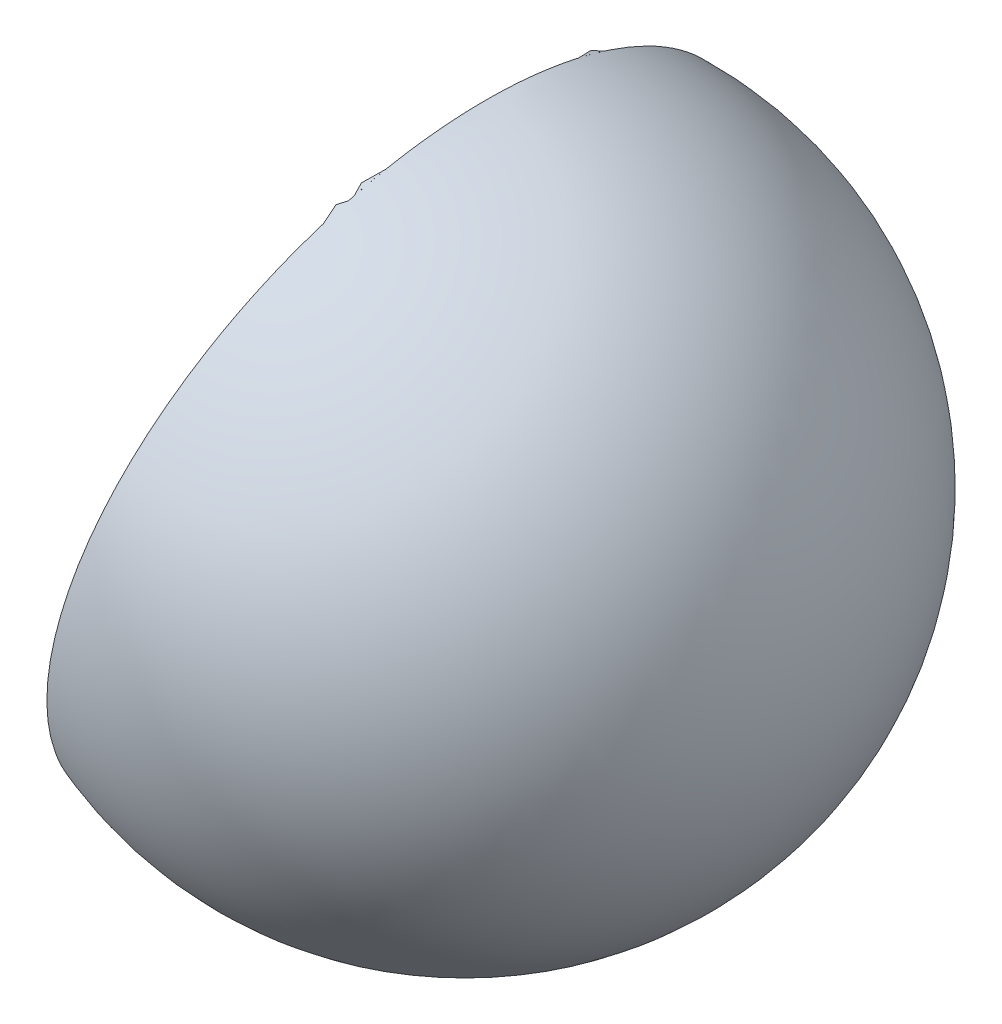
ISO-10303-21;
HEADER;
FILE_DESCRIPTION(('STEP AP214'),'2;1');
FILE_NAME('part.step','',(''),(''),'','','');
FILE_SCHEMA(('AUTOMOTIVE_DESIGN { 1 0 10303 214 1 1 1 1 }'));
ENDSEC;
DATA;
#1=APPLICATION_CONTEXT('core data for automotive mechanical design processes');
#2=APPLICATION_PROTOCOL_DEFINITION('international standard','automotive_design',2000,#1);
#3=PRODUCT_CONTEXT('',#1,'mechanical');
#4=PRODUCT('Part','Part','',(#3));
#5=PRODUCT_RELATED_PRODUCT_CATEGORY('part','',(#4));
#6=PRODUCT_DEFINITION_FORMATION('','',#4);
#7=PRODUCT_DEFINITION_CONTEXT('part definition',#1,'design');
#8=PRODUCT_DEFINITION('design','',#6,#7);
#9=PRODUCT_DEFINITION_SHAPE('','',#8);
#10=(LENGTH_UNIT() NAMED_UNIT(*) SI_UNIT(.MILLI.,.METRE.));
#11=(NAMED_UNIT(*) PLANE_ANGLE_UNIT() SI_UNIT($,.RADIAN.));
#12=(NAMED_UNIT(*) SI_UNIT($,.STERADIAN.) SOLID_ANGLE_UNIT());
#13=UNCERTAINTY_MEASURE_WITH_UNIT(LENGTH_MEASURE(1.E-05),#10,'distance_accuracy_value','');
#14=(GEOMETRIC_REPRESENTATION_CONTEXT(3) GLOBAL_UNCERTAINTY_ASSIGNED_CONTEXT((#13)) GLOBAL_UNIT_ASSIGNED_CONTEXT((#10,
#11,#12)) REPRESENTATION_CONTEXT('',''));
#15=CARTESIAN_POINT('',(0.,0.,0.));
#16=DIRECTION('',(0.,0.,1.));
#17=DIRECTION('',(1.,0.,0.));
#18=AXIS2_PLACEMENT_3D('',#15,#16,#17);
#19=CARTESIAN_POINT('',(-9.65925826289068,2.58819045102521,0.));
#20=DIRECTION('',(0.965925826289068,-0.258819045102521,0.));
#21=DIRECTION('',(0.258819045102521,0.965925826289068,0.));
#22=AXIS2_PLACEMENT_3D('',#19,#20,#21);
#23=PLANE('',#22);
#24=DIRECTION('',(-0.258819045102521,-0.965925826289068,0.));
#25=VECTOR('',#24,1.);
#26=CARTESIAN_POINT('',(-2.69443775918183,28.581254436464,1.75));
#27=LINE('',#26,#25);
#28=CARTESIAN_POINT('',(-2.69443775918183,28.581254436464,1.75000000000001));
#29=VERTEX_POINT('',#28);
#30=CARTESIAN_POINT('',(-7.30659314290877,11.3684562119928,1.75));
#31=VERTEX_POINT('',#30);
#32=EDGE_CURVE('E269',#29,#31,#27,.T.);
#33=ORIENTED_EDGE('',*,*,#32,.F.);
#34=CARTESIAN_POINT('',(-5.07050564619142,19.7136483599115,13.));
#35=DIRECTION('',(0.965925826289068,-0.258819045102521,0.));
#36=DIRECTION('',(0.258819045102521,0.965925826289068,0.));
#37=AXIS2_PLACEMENT_3D('',#34,#35,#36);
#38=CIRCLE('',#37,14.5204213483146);
#39=CARTESIAN_POINT('',(-2.69443775918184,28.581254436464,24.25));
#40=VERTEX_POINT('',#39);
#41=EDGE_CURVE('E272',#40,#29,#38,.F.);
#42=ORIENTED_EDGE('',*,*,#41,.F.);
#43=DIRECTION('',(0.258819045102521,0.965925826289068,0.));
#44=VECTOR('',#43,1.);
#45=CARTESIAN_POINT('',(-7.30659314290877,11.3684562119928,24.25));
#46=LINE('',#45,#44);
#47=CARTESIAN_POINT('',(-7.30659314290877,11.3684562119928,24.25));
#48=VERTEX_POINT('',#47);
#49=EDGE_CURVE('E274',#48,#40,#46,.T.);
#50=ORIENTED_EDGE('',*,*,#49,.F.);
#51=CARTESIAN_POINT('',(-4.93052525589918,20.2360622885454,13.));
#52=DIRECTION('',(0.965925826289068,-0.258819045102521,0.));
#53=DIRECTION('',(0.258819045102521,0.965925826289068,0.));
#54=AXIS2_PLACEMENT_3D('',#51,#52,#53);
#55=CIRCLE('',#54,14.5204213483146);
#56=EDGE_CURVE('E276',#31,#48,#55,.F.);
#57=ORIENTED_EDGE('',*,*,#56,.F.);
#58=EDGE_LOOP('',(#33,#42,#50,#57));
#59=FACE_BOUND('',#58,.T.);
#60=DIRECTION('',(-0.258819045102521,-0.965925826289068,0.));
#61=VECTOR('',#60,1.);
#62=CARTESIAN_POINT('',(-2.69443775918183,28.581254436464,-24.25));
#63=LINE('',#62,#61);
#64=CARTESIAN_POINT('',(-2.69443775918183,28.581254436464,-24.25));
#65=VERTEX_POINT('',#64);
#66=CARTESIAN_POINT('',(-7.30659314290877,11.3684562119928,-24.25));
#67=VERTEX_POINT('',#66);
#68=EDGE_CURVE('E251',#65,#67,#63,.T.);
#69=ORIENTED_EDGE('',*,*,#68,.F.);
#70=CARTESIAN_POINT('',(-5.07050564619142,19.7136483599115,-13.));
#71=DIRECTION('',(0.965925826289068,-0.258819045102521,0.));
#72=DIRECTION('',(0.258819045102521,0.965925826289068,0.));
#73=AXIS2_PLACEMENT_3D('',#70,#71,#72);
#74=CIRCLE('',#73,14.5204213483146);
#75=CARTESIAN_POINT('',(-2.69443775918184,28.581254436464,-1.74999999999999));
#76=VERTEX_POINT('',#75);
#77=EDGE_CURVE('E254',#76,#65,#74,.F.);
#78=ORIENTED_EDGE('',*,*,#77,.F.);
#79=DIRECTION('',(0.258819045102521,0.965925826289068,0.));
#80=VECTOR('',#79,1.);
#81=CARTESIAN_POINT('',(-7.30659314290877,11.3684562119928,-1.74999999999999));
#82=LINE('',#81,#80);
#83=CARTESIAN_POINT('',(-7.30659314290877,11.3684562119928,-1.74999999999999));
#84=VERTEX_POINT('',#83);
#85=EDGE_CURVE('E256',#84,#76,#82,.T.);
#86=ORIENTED_EDGE('',*,*,#85,.F.);
#87=CARTESIAN_POINT('',(-4.93052525589918,20.2360622885454,-13.));
#88=DIRECTION('',(0.965925826289068,-0.258819045102521,0.));
#89=DIRECTION('',(0.258819045102521,0.965925826289068,0.));
#90=AXIS2_PLACEMENT_3D('',#87,#88,#89);
#91=CIRCLE('',#90,14.5204213483146);
#92=EDGE_CURVE('E258',#67,#84,#91,.F.);
#93=ORIENTED_EDGE('',*,*,#92,.F.);
#94=EDGE_LOOP('',(#69,#78,#86,#93));
#95=FACE_BOUND('',#94,.T.);
#96=DIRECTION('',(-0.258819045102521,-0.965925826289068,0.));
#97=VECTOR('',#96,1.);
#98=CARTESIAN_POINT('',(-12.0119233828726,-6.19207530994241,-24.25));
#99=LINE('',#98,#97);
#100=CARTESIAN_POINT('',(-12.0119233828726,-6.19207530994241,-24.25));
#101=VERTEX_POINT('',#100);
#102=CARTESIAN_POINT('',(-16.6240787665995,-23.4048735344136,-24.25));
#103=VERTEX_POINT('',#102);
#104=EDGE_CURVE('E155',#101,#103,#99,.T.);
#105=ORIENTED_EDGE('',*,*,#104,.F.);
#106=CARTESIAN_POINT('',(-14.3879912698822,-15.059681386495,-13.));
#107=DIRECTION('',(0.965925826289068,-0.258819045102521,0.));
#108=DIRECTION('',(0.258819045102521,0.965925826289068,0.));
#109=AXIS2_PLACEMENT_3D('',#106,#107,#108);
#110=CIRCLE('',#109,14.5204213483146);
#111=CARTESIAN_POINT('',(-12.0119233828726,-6.19207530994242,-1.74999999999999));
#112=VERTEX_POINT('',#111);
#113=EDGE_CURVE('E245',#112,#101,#110,.F.);
#114=ORIENTED_EDGE('',*,*,#113,.F.);
#115=DIRECTION('',(0.258819045102521,0.965925826289068,0.));
#116=VECTOR('',#115,1.);
#117=CARTESIAN_POINT('',(-16.6240787665995,-23.4048735344136,-1.74999999999999));
#118=LINE('',#117,#116);
#119=CARTESIAN_POINT('',(-16.6240787665995,-23.4048735344136,-1.74999999999999));
#120=VERTEX_POINT('',#119);
#121=EDGE_CURVE('E247',#120,#112,#118,.T.);
#122=ORIENTED_EDGE('',*,*,#121,.F.);
#123=CARTESIAN_POINT('',(-14.24801087959,-14.537267457861,-13.));
#124=DIRECTION('',(0.965925826289068,-0.258819045102521,0.));
#125=DIRECTION('',(0.258819045102521,0.965925826289068,0.));
#126=AXIS2_PLACEMENT_3D('',#123,#124,#125);
#127=CIRCLE('',#126,14.5204213483146);
#128=EDGE_CURVE('E249',#103,#120,#127,.F.);
#129=ORIENTED_EDGE('',*,*,#128,.F.);
#130=EDGE_LOOP('',(#105,#114,#122,#129));
#131=FACE_BOUND('',#130,.T.);
#132=DIRECTION('',(-0.258819045102521,-0.965925826289068,0.));
#133=VECTOR('',#132,1.);
#134=CARTESIAN_POINT('',(-12.0119233828726,-6.19207530994241,1.75));
#135=LINE('',#134,#133);
#136=CARTESIAN_POINT('',(-12.0119233828726,-6.19207530994241,1.75000000000001));
#137=VERTEX_POINT('',#136);
#138=CARTESIAN_POINT('',(-16.6240787665995,-23.4048735344136,1.75));
#139=VERTEX_POINT('',#138);
#140=EDGE_CURVE('E260',#137,#139,#135,.T.);
#141=ORIENTED_EDGE('',*,*,#140,.F.);
#142=CARTESIAN_POINT('',(-14.3879912698822,-15.059681386495,13.));
#143=DIRECTION('',(0.965925826289068,-0.258819045102521,0.));
#144=DIRECTION('',(0.258819045102521,0.965925826289068,0.));
#145=AXIS2_PLACEMENT_3D('',#142,#143,#144);
#146=CIRCLE('',#145,14.5204213483146);
#147=CARTESIAN_POINT('',(-12.0119233828726,-6.19207530994242,24.25));
#148=VERTEX_POINT('',#147);
#149=EDGE_CURVE('E263',#148,#137,#146,.F.);
#150=ORIENTED_EDGE('',*,*,#149,.F.);
#151=DIRECTION('',(0.258819045102521,0.965925826289068,0.));
#152=VECTOR('',#151,1.);
#153=CARTESIAN_POINT('',(-16.6240787665995,-23.4048735344136,24.25));
#154=LINE('',#153,#152);
#155=CARTESIAN_POINT('',(-16.6240787665995,-23.4048735344136,24.25));
#156=VERTEX_POINT('',#155);
#157=EDGE_CURVE('E265',#156,#148,#154,.T.);
#158=ORIENTED_EDGE('',*,*,#157,.F.);
#159=CARTESIAN_POINT('',(-14.24801087959,-14.537267457861,13.));
#160=DIRECTION('',(0.965925826289068,-0.258819045102521,0.));
#161=DIRECTION('',(0.258819045102521,0.965925826289068,0.));
#162=AXIS2_PLACEMENT_3D('',#159,#160,#161);
#163=CIRCLE('',#162,14.5204213483146);
#164=EDGE_CURVE('E267',#139,#156,#163,.F.);
#165=ORIENTED_EDGE('',*,*,#164,.F.);
#166=EDGE_LOOP('',(#141,#150,#158,#165));
#167=FACE_BOUND('',#166,.T.);
#168=DIRECTION('',(0.,0.,-1.));
#169=VECTOR('',#168,1.);
#170=CARTESIAN_POINT('',(-21.0707295013458,-40.,0.));
#171=LINE('',#170,#169);
#172=CARTESIAN_POINT('',(-21.0707295013458,-40.,21.3547268369585));
#173=VERTEX_POINT('',#172);
#174=CARTESIAN_POINT('',(-21.0707295013458,-40.,-21.3547268369585));
#175=VERTEX_POINT('',#174);
#176=EDGE_CURVE('E41',#173,#175,#171,.T.);
#177=ORIENTED_EDGE('',*,*,#176,.F.);
#178=CARTESIAN_POINT('',(-9.65925826289068,2.58819045102521,0.));
#179=DIRECTION('',(0.965925826289068,-0.258819045102521,0.));
#180=DIRECTION('',(0.258819045102521,0.965925826289068,0.));
#181=AXIS2_PLACEMENT_3D('',#178,#179,#180);
#182=CIRCLE('',#181,48.9897948556636);
#183=EDGE_CURVE('E12',#175,#173,#182,.T.);
#184=ORIENTED_EDGE('',*,*,#183,.F.);
#185=EDGE_LOOP('',(#177,#184));
#186=FACE_BOUND('',#185,.T.);
#187=ADVANCED_FACE('F34',(#59,#95,#131,#167,#186),#23,.F.);
#188=CARTESIAN_POINT('',(-30.1470403346465,-19.7814069029783,-1.74999999999999));
#189=DIRECTION('',(0.,0.,1.));
#190=DIRECTION('',(1.,0.,0.));
#191=AXIS2_PLACEMENT_3D('',#188,#189,#190);
#192=PLANE('',#191);
#193=DIRECTION('',(0.965925826289068,-0.258819045102521,0.));
#194=VECTOR('',#193,1.);
#195=CARTESIAN_POINT('',(-30.1470403346465,-19.7814069029783,-1.74999999999999));
#196=LINE('',#195,#194);
#197=CARTESIAN_POINT('',(-6.96482050370885,-25.9930639854388,-1.74999999999999));
#198=VERTEX_POINT('',#197);
#199=EDGE_CURVE('E173',#120,#198,#196,.T.);
#200=ORIENTED_EDGE('',*,*,#199,.F.);
#201=ORIENTED_EDGE('',*,*,#121,.T.);
#202=DIRECTION('',(0.965925826289068,-0.258819045102521,0.));
#203=VECTOR('',#202,1.);
#204=CARTESIAN_POINT('',(-25.5348849509196,-2.56860867850712,-1.74999999999999));
#205=LINE('',#204,#203);
#206=CARTESIAN_POINT('',(-2.35266511998192,-8.78026576096763,-1.74999999999999));
#207=VERTEX_POINT('',#206);
#208=EDGE_CURVE('E180',#112,#207,#205,.T.);
#209=ORIENTED_EDGE('',*,*,#208,.T.);
#210=DIRECTION('',(-0.258819045102521,-0.965925826289068,0.));
#211=VECTOR('',#210,1.);
#212=CARTESIAN_POINT('',(-6.96482050370885,-25.9930639854388,-1.74999999999999));
#213=LINE('',#212,#211);
#214=EDGE_CURVE('E159',#207,#198,#213,.T.);
#215=ORIENTED_EDGE('',*,*,#214,.T.);
#216=EDGE_LOOP('',(#200,#201,#209,#215));
#217=FACE_BOUND('',#216,.T.);
#218=ADVANCED_FACE('F292',(#217),#192,.F.);
#219=CARTESIAN_POINT('',(-4.58875261669927,-17.1254579088863,-13.));
#220=DIRECTION('',(0.965925826289068,-0.258819045102521,0.));
#221=DIRECTION('',(0.258819045102521,0.965925826289068,0.));
#222=AXIS2_PLACEMENT_3D('',#219,#220,#221);
#223=PLANE('',#222);
#224=CARTESIAN_POINT('',(-4.58875261669927,-17.1254579088863,-13.));
#225=DIRECTION('',(0.965925826289068,-0.258819045102521,0.));
#226=DIRECTION('',(0.258819045102521,0.965925826289068,0.));
#227=AXIS2_PLACEMENT_3D('',#224,#225,#226);
#228=CIRCLE('',#227,14.5204213483146);
#229=CARTESIAN_POINT('',(-6.96482050370885,-25.9930639854388,-24.25));
#230=VERTEX_POINT('',#229);
#231=EDGE_CURVE('E166',#198,#230,#228,.T.);
#232=ORIENTED_EDGE('',*,*,#231,.F.);
#233=ORIENTED_EDGE('',*,*,#214,.F.);
#234=CARTESIAN_POINT('',(-4.7287330069915,-17.6478718375202,-13.));
#235=DIRECTION('',(0.965925826289068,-0.258819045102521,0.));
#236=DIRECTION('',(-0.258819045102521,-0.965925826289068,0.));
#237=AXIS2_PLACEMENT_3D('',#234,#235,#236);
#238=CIRCLE('',#237,14.5204213483146);
#239=CARTESIAN_POINT('',(-2.35266511998192,-8.78026576096762,-24.25));
#240=VERTEX_POINT('',#239);
#241=EDGE_CURVE('E169',#240,#207,#238,.T.);
#242=ORIENTED_EDGE('',*,*,#241,.F.);
#243=DIRECTION('',(0.258819045102521,0.965925826289068,0.));
#244=VECTOR('',#243,1.);
#245=CARTESIAN_POINT('',(-2.35266511998192,-8.78026576096762,-24.25));
#246=LINE('',#245,#244);
#247=EDGE_CURVE('E153',#230,#240,#246,.T.);
#248=ORIENTED_EDGE('',*,*,#247,.F.);
#249=EDGE_LOOP('',(#232,#233,#242,#248));
#250=FACE_BOUND('',#249,.T.);
#251=ADVANCED_FACE('F164',(#250),#223,.F.);
#252=CARTESIAN_POINT('',(-27.7709724476369,-10.9138008264257,-13.));
#253=DIRECTION('',(0.965925826289068,-0.258819045102521,0.));
#254=DIRECTION('',(0.258819045102521,0.965925826289068,0.));
#255=AXIS2_PLACEMENT_3D('',#252,#253,#254);
#256=CYLINDRICAL_SURFACE('',#255,14.5204213483146);
#257=DIRECTION('',(0.965925826289068,-0.258819045102521,0.));
#258=VECTOR('',#257,1.);
#259=CARTESIAN_POINT('',(-30.1470403346465,-19.7814069029783,-24.25));
#260=LINE('',#259,#258);
#261=EDGE_CURVE('E149',#103,#230,#260,.T.);
#262=ORIENTED_EDGE('',*,*,#261,.F.);
#263=ORIENTED_EDGE('',*,*,#128,.T.);
#264=ORIENTED_EDGE('',*,*,#199,.T.);
#265=ORIENTED_EDGE('',*,*,#231,.T.);
#266=EDGE_LOOP('',(#262,#263,#264,#265));
#267=FACE_BOUND('',#266,.T.);
#268=ADVANCED_FACE('F171',(#267),#256,.F.);
#269=CARTESIAN_POINT('',(-27.9109528379291,-11.4362147550597,-13.));
#270=DIRECTION('',(0.965925826289068,-0.258819045102521,0.));
#271=DIRECTION('',(0.258819045102521,0.965925826289068,0.));
#272=AXIS2_PLACEMENT_3D('',#269,#270,#271);
#273=CYLINDRICAL_SURFACE('',#272,14.5204213483146);
#274=ORIENTED_EDGE('',*,*,#208,.F.);
#275=ORIENTED_EDGE('',*,*,#113,.T.);
#276=DIRECTION('',(0.965925826289068,-0.258819045102521,0.));
#277=VECTOR('',#276,1.);
#278=CARTESIAN_POINT('',(-25.5348849509196,-2.56860867850711,-24.25));
#279=LINE('',#278,#277);
#280=EDGE_CURVE('E158',#101,#240,#279,.T.);
#281=ORIENTED_EDGE('',*,*,#280,.T.);
#282=ORIENTED_EDGE('',*,*,#241,.T.);
#283=EDGE_LOOP('',(#274,#275,#281,#282));
#284=FACE_BOUND('',#283,.T.);
#285=ADVANCED_FACE('F408',(#284),#273,.F.);
#286=CARTESIAN_POINT('',(-25.5348849509196,-2.56860867850711,-24.25));
#287=DIRECTION('',(0.,0.,-1.));
#288=DIRECTION('',(-1.,0.,0.));
#289=AXIS2_PLACEMENT_3D('',#286,#287,#288);
#290=PLANE('',#289);
#291=ORIENTED_EDGE('',*,*,#280,.F.);
#292=ORIENTED_EDGE('',*,*,#104,.T.);
#293=ORIENTED_EDGE('',*,*,#261,.T.);
#294=ORIENTED_EDGE('',*,*,#247,.T.);
#295=EDGE_LOOP('',(#291,#292,#293,#294));
#296=FACE_BOUND('',#295,.T.);
#297=ADVANCED_FACE('F152',(#296),#290,.F.);
#298=CARTESIAN_POINT('',(-20.8295547109557,14.9919228434281,-1.74999999999999));
#299=DIRECTION('',(0.,0.,1.));
#300=DIRECTION('',(1.,0.,0.));
#301=AXIS2_PLACEMENT_3D('',#298,#299,#300);
#302=PLANE('',#301);
#303=DIRECTION('',(0.965925826289068,-0.258819045102521,0.));
#304=VECTOR('',#303,1.);
#305=CARTESIAN_POINT('',(-20.8295547109557,14.9919228434281,-1.74999999999999));
#306=LINE('',#305,#304);
#307=CARTESIAN_POINT('',(2.35266511998192,8.78026576096762,-1.74999999999999));
#308=VERTEX_POINT('',#307);
#309=EDGE_CURVE('E195',#84,#308,#306,.T.);
#310=ORIENTED_EDGE('',*,*,#309,.F.);
#311=ORIENTED_EDGE('',*,*,#85,.T.);
#312=DIRECTION('',(0.965925826289068,-0.258819045102521,0.));
#313=VECTOR('',#312,1.);
#314=CARTESIAN_POINT('',(-16.2173993272288,32.2047210678993,-1.74999999999999));
#315=LINE('',#314,#313);
#316=CARTESIAN_POINT('',(6.96482050370885,25.9930639854388,-1.74999999999999));
#317=VERTEX_POINT('',#316);
#318=EDGE_CURVE('E198',#76,#317,#315,.T.);
#319=ORIENTED_EDGE('',*,*,#318,.T.);
#320=DIRECTION('',(-0.258819045102521,-0.965925826289068,0.));
#321=VECTOR('',#320,1.);
#322=CARTESIAN_POINT('',(2.35266511998192,8.78026576096762,-1.74999999999999));
#323=LINE('',#322,#321);
#324=EDGE_CURVE('E191',#317,#308,#323,.T.);
#325=ORIENTED_EDGE('',*,*,#324,.T.);
#326=EDGE_LOOP('',(#310,#311,#319,#325));
#327=FACE_BOUND('',#326,.T.);
#328=ADVANCED_FACE('F407',(#327),#302,.F.);
#329=CARTESIAN_POINT('',(4.7287330069915,17.6478718375202,-13.));
#330=DIRECTION('',(0.965925826289068,-0.258819045102521,0.));
#331=DIRECTION('',(0.258819045102521,0.965925826289068,0.));
#332=AXIS2_PLACEMENT_3D('',#329,#330,#331);
#333=PLANE('',#332);
#334=CARTESIAN_POINT('',(4.7287330069915,17.6478718375202,-13.));
#335=DIRECTION('',(0.965925826289068,-0.258819045102521,0.));
#336=DIRECTION('',(0.258819045102521,0.965925826289068,0.));
#337=AXIS2_PLACEMENT_3D('',#334,#335,#336);
#338=CIRCLE('',#337,14.5204213483146);
#339=CARTESIAN_POINT('',(2.35266511998192,8.78026576096762,-24.25));
#340=VERTEX_POINT('',#339);
#341=EDGE_CURVE('E179',#308,#340,#338,.T.);
#342=ORIENTED_EDGE('',*,*,#341,.F.);
#343=ORIENTED_EDGE('',*,*,#324,.F.);
#344=CARTESIAN_POINT('',(4.58875261669927,17.1254579088863,-13.));
#345=DIRECTION('',(0.965925826289068,-0.258819045102521,0.));
#346=DIRECTION('',(-0.258819045102521,-0.965925826289068,0.));
#347=AXIS2_PLACEMENT_3D('',#344,#345,#346);
#348=CIRCLE('',#347,14.5204213483146);
#349=CARTESIAN_POINT('',(6.96482050370885,25.9930639854388,-24.25));
#350=VERTEX_POINT('',#349);
#351=EDGE_CURVE('E188',#350,#317,#348,.T.);
#352=ORIENTED_EDGE('',*,*,#351,.F.);
#353=DIRECTION('',(0.258819045102521,0.965925826289068,0.));
#354=VECTOR('',#353,1.);
#355=CARTESIAN_POINT('',(6.96482050370885,25.9930639854388,-24.25));
#356=LINE('',#355,#354);
#357=EDGE_CURVE('E185',#340,#350,#356,.T.);
#358=ORIENTED_EDGE('',*,*,#357,.F.);
#359=EDGE_LOOP('',(#342,#343,#352,#358));
#360=FACE_BOUND('',#359,.T.);
#361=ADVANCED_FACE('F431',(#360),#333,.F.);
#362=CARTESIAN_POINT('',(-18.4534868239461,23.8595289199807,-13.));
#363=DIRECTION('',(0.965925826289068,-0.258819045102521,0.));
#364=DIRECTION('',(0.258819045102521,0.965925826289068,0.));
#365=AXIS2_PLACEMENT_3D('',#362,#363,#364);
#366=CYLINDRICAL_SURFACE('',#365,14.5204213483146);
#367=DIRECTION('',(0.965925826289068,-0.258819045102521,0.));
#368=VECTOR('',#367,1.);
#369=CARTESIAN_POINT('',(-20.8295547109557,14.9919228434281,-24.25));
#370=LINE('',#369,#368);
#371=EDGE_CURVE('E194',#67,#340,#370,.T.);
#372=ORIENTED_EDGE('',*,*,#371,.F.);
#373=ORIENTED_EDGE('',*,*,#92,.T.);
#374=ORIENTED_EDGE('',*,*,#309,.T.);
#375=ORIENTED_EDGE('',*,*,#341,.T.);
#376=EDGE_LOOP('',(#372,#373,#374,#375));
#377=FACE_BOUND('',#376,.T.);
#378=ADVANCED_FACE('F436',(#377),#366,.F.);
#379=CARTESIAN_POINT('',(-18.5934672142384,23.3371149913468,-13.));
#380=DIRECTION('',(0.965925826289068,-0.258819045102521,0.));
#381=DIRECTION('',(0.258819045102521,0.965925826289068,0.));
#382=AXIS2_PLACEMENT_3D('',#379,#380,#381);
#383=CYLINDRICAL_SURFACE('',#382,14.5204213483146);
#384=ORIENTED_EDGE('',*,*,#318,.F.);
#385=ORIENTED_EDGE('',*,*,#77,.T.);
#386=DIRECTION('',(0.965925826289068,-0.258819045102521,0.));
#387=VECTOR('',#386,1.);
#388=CARTESIAN_POINT('',(-16.2173993272288,32.2047210678993,-24.25));
#389=LINE('',#388,#387);
#390=EDGE_CURVE('E200',#65,#350,#389,.T.);
#391=ORIENTED_EDGE('',*,*,#390,.T.);
#392=ORIENTED_EDGE('',*,*,#351,.T.);
#393=EDGE_LOOP('',(#384,#385,#391,#392));
#394=FACE_BOUND('',#393,.T.);
#395=ADVANCED_FACE('F450',(#394),#383,.F.);
#396=CARTESIAN_POINT('',(-16.2173993272288,32.2047210678993,-24.25));
#397=DIRECTION('',(0.,0.,-1.));
#398=DIRECTION('',(-1.,0.,0.));
#399=AXIS2_PLACEMENT_3D('',#396,#397,#398);
#400=PLANE('',#399);
#401=ORIENTED_EDGE('',*,*,#390,.F.);
#402=ORIENTED_EDGE('',*,*,#68,.T.);
#403=ORIENTED_EDGE('',*,*,#371,.T.);
#404=ORIENTED_EDGE('',*,*,#357,.T.);
#405=EDGE_LOOP('',(#401,#402,#403,#404));
#406=FACE_BOUND('',#405,.T.);
#407=ADVANCED_FACE('F444',(#406),#400,.F.);
#408=CARTESIAN_POINT('',(-30.1470403346465,-19.7814069029783,24.25));
#409=DIRECTION('',(0.,0.,1.));
#410=DIRECTION('',(1.,0.,0.));
#411=AXIS2_PLACEMENT_3D('',#408,#409,#410);
#412=PLANE('',#411);
#413=DIRECTION('',(0.965925826289068,-0.258819045102521,0.));
#414=VECTOR('',#413,1.);
#415=CARTESIAN_POINT('',(-30.1470403346465,-19.7814069029783,24.25));
#416=LINE('',#415,#414);
#417=CARTESIAN_POINT('',(-6.96482050370885,-25.9930639854388,24.25));
#418=VERTEX_POINT('',#417);
#419=EDGE_CURVE('E215',#156,#418,#416,.T.);
#420=ORIENTED_EDGE('',*,*,#419,.F.);
#421=ORIENTED_EDGE('',*,*,#157,.T.);
#422=DIRECTION('',(0.965925826289068,-0.258819045102521,0.));
#423=VECTOR('',#422,1.);
#424=CARTESIAN_POINT('',(-25.5348849509196,-2.56860867850712,24.25));
#425=LINE('',#424,#423);
#426=CARTESIAN_POINT('',(-2.35266511998192,-8.78026576096763,24.25));
#427=VERTEX_POINT('',#426);
#428=EDGE_CURVE('E218',#148,#427,#425,.T.);
#429=ORIENTED_EDGE('',*,*,#428,.T.);
#430=DIRECTION('',(-0.258819045102521,-0.965925826289068,0.));
#431=VECTOR('',#430,1.);
#432=CARTESIAN_POINT('',(-6.96482050370885,-25.9930639854388,24.25));
#433=LINE('',#432,#431);
#434=EDGE_CURVE('E211',#427,#418,#433,.T.);
#435=ORIENTED_EDGE('',*,*,#434,.T.);
#436=EDGE_LOOP('',(#420,#421,#429,#435));
#437=FACE_BOUND('',#436,.T.);
#438=ADVANCED_FACE('F327',(#437),#412,.F.);
#439=CARTESIAN_POINT('',(-4.58875261669927,-17.1254579088863,13.));
#440=DIRECTION('',(0.965925826289068,-0.258819045102521,0.));
#441=DIRECTION('',(0.258819045102521,0.965925826289068,0.));
#442=AXIS2_PLACEMENT_3D('',#439,#440,#441);
#443=PLANE('',#442);
#444=CARTESIAN_POINT('',(-4.58875261669927,-17.1254579088863,13.));
#445=DIRECTION('',(0.965925826289068,-0.258819045102521,0.));
#446=DIRECTION('',(0.258819045102521,0.965925826289068,0.));
#447=AXIS2_PLACEMENT_3D('',#444,#445,#446);
#448=CIRCLE('',#447,14.5204213483146);
#449=CARTESIAN_POINT('',(-6.96482050370885,-25.9930639854388,1.75));
#450=VERTEX_POINT('',#449);
#451=EDGE_CURVE('E197',#418,#450,#448,.T.);
#452=ORIENTED_EDGE('',*,*,#451,.F.);
#453=ORIENTED_EDGE('',*,*,#434,.F.);
#454=CARTESIAN_POINT('',(-4.7287330069915,-17.6478718375202,13.));
#455=DIRECTION('',(0.965925826289068,-0.258819045102521,0.));
#456=DIRECTION('',(-0.258819045102521,-0.965925826289068,0.));
#457=AXIS2_PLACEMENT_3D('',#454,#455,#456);
#458=CIRCLE('',#457,14.5204213483146);
#459=CARTESIAN_POINT('',(-2.35266511998192,-8.78026576096762,1.75000000000001));
#460=VERTEX_POINT('',#459);
#461=EDGE_CURVE('E208',#460,#427,#458,.T.);
#462=ORIENTED_EDGE('',*,*,#461,.F.);
#463=DIRECTION('',(0.258819045102521,0.965925826289068,0.));
#464=VECTOR('',#463,1.);
#465=CARTESIAN_POINT('',(-2.35266511998192,-8.78026576096762,1.75));
#466=LINE('',#465,#464);
#467=EDGE_CURVE('E205',#450,#460,#466,.T.);
#468=ORIENTED_EDGE('',*,*,#467,.F.);
#469=EDGE_LOOP('',(#452,#453,#462,#468));
#470=FACE_BOUND('',#469,.T.);
#471=ADVANCED_FACE('F324',(#470),#443,.F.);
#472=CARTESIAN_POINT('',(-27.7709724476369,-10.9138008264257,13.));
#473=DIRECTION('',(0.965925826289068,-0.258819045102521,0.));
#474=DIRECTION('',(0.258819045102521,0.965925826289068,0.));
#475=AXIS2_PLACEMENT_3D('',#472,#473,#474);
#476=CYLINDRICAL_SURFACE('',#475,14.5204213483146);
#477=DIRECTION('',(0.965925826289068,-0.258819045102521,0.));
#478=VECTOR('',#477,1.);
#479=CARTESIAN_POINT('',(-30.1470403346465,-19.7814069029783,1.75));
#480=LINE('',#479,#478);
#481=EDGE_CURVE('E214',#139,#450,#480,.T.);
#482=ORIENTED_EDGE('',*,*,#481,.F.);
#483=ORIENTED_EDGE('',*,*,#164,.T.);
#484=ORIENTED_EDGE('',*,*,#419,.T.);
#485=ORIENTED_EDGE('',*,*,#451,.T.);
#486=EDGE_LOOP('',(#482,#483,#484,#485));
#487=FACE_BOUND('',#486,.T.);
#488=ADVANCED_FACE('F329',(#487),#476,.F.);
#489=CARTESIAN_POINT('',(-27.9109528379291,-11.4362147550597,13.));
#490=DIRECTION('',(0.965925826289068,-0.258819045102521,0.));
#491=DIRECTION('',(0.258819045102521,0.965925826289068,0.));
#492=AXIS2_PLACEMENT_3D('',#489,#490,#491);
#493=CYLINDRICAL_SURFACE('',#492,14.5204213483146);
#494=ORIENTED_EDGE('',*,*,#428,.F.);
#495=ORIENTED_EDGE('',*,*,#149,.T.);
#496=DIRECTION('',(0.965925826289068,-0.258819045102521,0.));
#497=VECTOR('',#496,1.);
#498=CARTESIAN_POINT('',(-25.5348849509196,-2.56860867850711,1.75000000000001));
#499=LINE('',#498,#497);
#500=EDGE_CURVE('E220',#137,#460,#499,.T.);
#501=ORIENTED_EDGE('',*,*,#500,.T.);
#502=ORIENTED_EDGE('',*,*,#461,.T.);
#503=EDGE_LOOP('',(#494,#495,#501,#502));
#504=FACE_BOUND('',#503,.T.);
#505=ADVANCED_FACE('F320',(#504),#493,.F.);
#506=CARTESIAN_POINT('',(-25.5348849509196,-2.56860867850711,1.75));
#507=DIRECTION('',(0.,0.,-1.));
#508=DIRECTION('',(-1.,0.,0.));
#509=AXIS2_PLACEMENT_3D('',#506,#507,#508);
#510=PLANE('',#509);
#511=ORIENTED_EDGE('',*,*,#500,.F.);
#512=ORIENTED_EDGE('',*,*,#140,.T.);
#513=ORIENTED_EDGE('',*,*,#481,.T.);
#514=ORIENTED_EDGE('',*,*,#467,.T.);
#515=EDGE_LOOP('',(#511,#512,#513,#514));
#516=FACE_BOUND('',#515,.T.);
#517=ADVANCED_FACE('F316',(#516),#510,.F.);
#518=CARTESIAN_POINT('',(-20.8295547109557,14.9919228434281,24.25));
#519=DIRECTION('',(0.,0.,1.));
#520=DIRECTION('',(1.,0.,0.));
#521=AXIS2_PLACEMENT_3D('',#518,#519,#520);
#522=PLANE('',#521);
#523=DIRECTION('',(0.965925826289068,-0.258819045102521,0.));
#524=VECTOR('',#523,1.);
#525=CARTESIAN_POINT('',(-20.8295547109557,14.9919228434281,24.25));
#526=LINE('',#525,#524);
#527=CARTESIAN_POINT('',(2.35266511998192,8.78026576096762,24.25));
#528=VERTEX_POINT('',#527);
#529=EDGE_CURVE('E235',#48,#528,#526,.T.);
#530=ORIENTED_EDGE('',*,*,#529,.F.);
#531=ORIENTED_EDGE('',*,*,#49,.T.);
#532=DIRECTION('',(0.965925826289068,-0.258819045102521,0.));
#533=VECTOR('',#532,1.);
#534=CARTESIAN_POINT('',(-16.2173993272288,32.2047210678993,24.25));
#535=LINE('',#534,#533);
#536=CARTESIAN_POINT('',(6.96482050370885,25.9930639854388,24.25));
#537=VERTEX_POINT('',#536);
#538=EDGE_CURVE('E238',#40,#537,#535,.T.);
#539=ORIENTED_EDGE('',*,*,#538,.T.);
#540=DIRECTION('',(-0.258819045102521,-0.965925826289068,0.));
#541=VECTOR('',#540,1.);
#542=CARTESIAN_POINT('',(2.35266511998192,8.78026576096762,24.25));
#543=LINE('',#542,#541);
#544=EDGE_CURVE('E231',#537,#528,#543,.T.);
#545=ORIENTED_EDGE('',*,*,#544,.T.);
#546=EDGE_LOOP('',(#530,#531,#539,#545));
#547=FACE_BOUND('',#546,.T.);
#548=ADVANCED_FACE('F344',(#547),#522,.F.);
#549=CARTESIAN_POINT('',(4.7287330069915,17.6478718375202,13.));
#550=DIRECTION('',(0.965925826289068,-0.258819045102521,0.));
#551=DIRECTION('',(0.258819045102521,0.965925826289068,0.));
#552=AXIS2_PLACEMENT_3D('',#549,#550,#551);
#553=PLANE('',#552);
#554=CARTESIAN_POINT('',(4.7287330069915,17.6478718375202,13.));
#555=DIRECTION('',(0.965925826289068,-0.258819045102521,0.));
#556=DIRECTION('',(0.258819045102521,0.965925826289068,0.));
#557=AXIS2_PLACEMENT_3D('',#554,#555,#556);
#558=CIRCLE('',#557,14.5204213483146);
#559=CARTESIAN_POINT('',(2.35266511998192,8.78026576096762,1.75));
#560=VERTEX_POINT('',#559);
#561=EDGE_CURVE('E217',#528,#560,#558,.T.);
#562=ORIENTED_EDGE('',*,*,#561,.F.);
#563=ORIENTED_EDGE('',*,*,#544,.F.);
#564=CARTESIAN_POINT('',(4.58875261669927,17.1254579088863,13.));
#565=DIRECTION('',(0.965925826289068,-0.258819045102521,0.));
#566=DIRECTION('',(-0.258819045102521,-0.965925826289068,0.));
#567=AXIS2_PLACEMENT_3D('',#564,#565,#566);
#568=CIRCLE('',#567,14.5204213483146);
#569=CARTESIAN_POINT('',(6.96482050370885,25.9930639854388,1.75000000000001));
#570=VERTEX_POINT('',#569);
#571=EDGE_CURVE('E228',#570,#537,#568,.T.);
#572=ORIENTED_EDGE('',*,*,#571,.F.);
#573=DIRECTION('',(0.258819045102521,0.965925826289068,0.));
#574=VECTOR('',#573,1.);
#575=CARTESIAN_POINT('',(6.96482050370885,25.9930639854388,1.75));
#576=LINE('',#575,#574);
#577=EDGE_CURVE('E225',#560,#570,#576,.T.);
#578=ORIENTED_EDGE('',*,*,#577,.F.);
#579=EDGE_LOOP('',(#562,#563,#572,#578));
#580=FACE_BOUND('',#579,.T.);
#581=ADVANCED_FACE('F340',(#580),#553,.F.);
#582=CARTESIAN_POINT('',(-18.4534868239461,23.8595289199807,13.));
#583=DIRECTION('',(0.965925826289068,-0.258819045102521,0.));
#584=DIRECTION('',(0.258819045102521,0.965925826289068,0.));
#585=AXIS2_PLACEMENT_3D('',#582,#583,#584);
#586=CYLINDRICAL_SURFACE('',#585,14.5204213483146);
#587=DIRECTION('',(0.965925826289068,-0.258819045102521,0.));
#588=VECTOR('',#587,1.);
#589=CARTESIAN_POINT('',(-20.8295547109557,14.9919228434281,1.75));
#590=LINE('',#589,#588);
#591=EDGE_CURVE('E234',#31,#560,#590,.T.);
#592=ORIENTED_EDGE('',*,*,#591,.F.);
#593=ORIENTED_EDGE('',*,*,#56,.T.);
#594=ORIENTED_EDGE('',*,*,#529,.T.);
#595=ORIENTED_EDGE('',*,*,#561,.T.);
#596=EDGE_LOOP('',(#592,#593,#594,#595));
#597=FACE_BOUND('',#596,.T.);
#598=ADVANCED_FACE('F343',(#597),#586,.F.);
#599=CARTESIAN_POINT('',(-18.5934672142384,23.3371149913468,13.));
#600=DIRECTION('',(0.965925826289068,-0.258819045102521,0.));
#601=DIRECTION('',(0.258819045102521,0.965925826289068,0.));
#602=AXIS2_PLACEMENT_3D('',#599,#600,#601);
#603=CYLINDRICAL_SURFACE('',#602,14.5204213483146);
#604=ORIENTED_EDGE('',*,*,#538,.F.);
#605=ORIENTED_EDGE('',*,*,#41,.T.);
#606=DIRECTION('',(0.965925826289068,-0.258819045102521,0.));
#607=VECTOR('',#606,1.);
#608=CARTESIAN_POINT('',(-16.2173993272288,32.2047210678993,1.75000000000001));
#609=LINE('',#608,#607);
#610=EDGE_CURVE('E240',#29,#570,#609,.T.);
#611=ORIENTED_EDGE('',*,*,#610,.T.);
#612=ORIENTED_EDGE('',*,*,#571,.T.);
#613=EDGE_LOOP('',(#604,#605,#611,#612));
#614=FACE_BOUND('',#613,.T.);
#615=ADVANCED_FACE('F288',(#614),#603,.F.);
#616=CARTESIAN_POINT('',(-16.2173993272288,32.2047210678993,1.75));
#617=DIRECTION('',(0.,0.,-1.));
#618=DIRECTION('',(-1.,0.,0.));
#619=AXIS2_PLACEMENT_3D('',#616,#617,#618);
#620=PLANE('',#619);
#621=ORIENTED_EDGE('',*,*,#610,.F.);
#622=ORIENTED_EDGE('',*,*,#32,.T.);
#623=ORIENTED_EDGE('',*,*,#591,.T.);
#624=ORIENTED_EDGE('',*,*,#577,.T.);
#625=EDGE_LOOP('',(#621,#622,#623,#624));
#626=FACE_BOUND('',#625,.T.);
#627=ADVANCED_FACE('F282',(#626),#620,.F.);
#628=CARTESIAN_POINT('',(0.,0.,0.));
#629=DIRECTION('',(0.,1.,0.));
#630=DIRECTION('',(1.,0.,0.));
#631=AXIS2_PLACEMENT_3D('',#628,#629,#630);
#632=SPHERICAL_SURFACE('',#631,50.);
#633=CARTESIAN_POINT('',(0.,-40.,0.));
#634=DIRECTION('',(0.,1.,0.));
#635=DIRECTION('',(0.,0.,1.));
#636=AXIS2_PLACEMENT_3D('',#633,#634,#635);
#637=CIRCLE('',#636,30.);
#638=EDGE_CURVE('E237',#173,#175,#637,.T.);
#639=ORIENTED_EDGE('',*,*,#638,.T.);
#640=ORIENTED_EDGE('',*,*,#183,.T.);
#641=EDGE_LOOP('',(#639,#640));
#642=FACE_BOUND('',#641,.T.);
#643=ADVANCED_FACE('F280',(#642),#632,.T.);
#644=CARTESIAN_POINT('',(0.,-40.,0.));
#645=DIRECTION('',(0.,1.,0.));
#646=DIRECTION('',(0.,0.,1.));
#647=AXIS2_PLACEMENT_3D('',#644,#645,#646);
#648=PLANE('',#647);
#649=ORIENTED_EDGE('',*,*,#638,.F.);
#650=ORIENTED_EDGE('',*,*,#176,.T.);
#651=EDGE_LOOP('',(#649,#650));
#652=FACE_BOUND('',#651,.T.);
#653=ADVANCED_FACE('F279',(#652),#648,.F.);
#654=CLOSED_SHELL('',(#187,#218,#251,#268,#285,#297,#328,#361,#378,#395,#407,#438,#471,#488,
#505,#517,#548,#581,#598,#615,#627,#643,#653));
#655=MANIFOLD_SOLID_BREP('B2',#654);
#656=ADVANCED_BREP_SHAPE_REPRESENTATION('',(#18,#655),#14);
#657=SHAPE_DEFINITION_REPRESENTATION(#9,#656);
ENDSEC;
END-ISO-10303-21;
